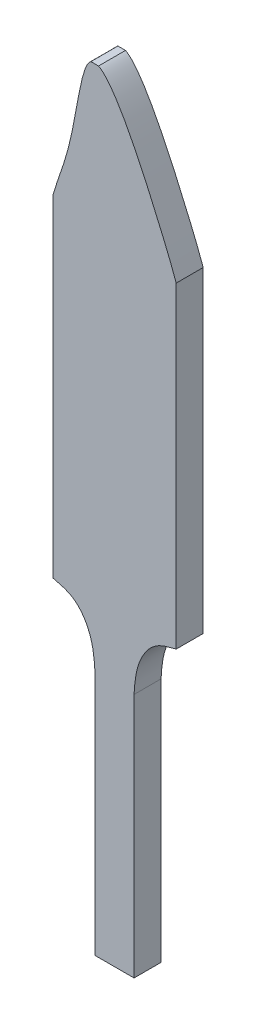
ISO-10303-21;
HEADER;
FILE_DESCRIPTION(('STEP AP214'),'2;1');
FILE_NAME('part.step','',(''),(''),'','','');
FILE_SCHEMA(('AUTOMOTIVE_DESIGN { 1 0 10303 214 1 1 1 1 }'));
ENDSEC;
DATA;
#1=APPLICATION_CONTEXT('core data for automotive mechanical design processes');
#2=APPLICATION_PROTOCOL_DEFINITION('international standard','automotive_design',2000,#1);
#3=PRODUCT_CONTEXT('',#1,'mechanical');
#4=PRODUCT('Part','Part','',(#3));
#5=PRODUCT_RELATED_PRODUCT_CATEGORY('part','',(#4));
#6=PRODUCT_DEFINITION_FORMATION('','',#4);
#7=PRODUCT_DEFINITION_CONTEXT('part definition',#1,'design');
#8=PRODUCT_DEFINITION('design','',#6,#7);
#9=PRODUCT_DEFINITION_SHAPE('','',#8);
#10=(LENGTH_UNIT() NAMED_UNIT(*) SI_UNIT(.MILLI.,.METRE.));
#11=(NAMED_UNIT(*) PLANE_ANGLE_UNIT() SI_UNIT($,.RADIAN.));
#12=(NAMED_UNIT(*) SI_UNIT($,.STERADIAN.) SOLID_ANGLE_UNIT());
#13=UNCERTAINTY_MEASURE_WITH_UNIT(LENGTH_MEASURE(1.E-05),#10,'distance_accuracy_value','');
#14=(GEOMETRIC_REPRESENTATION_CONTEXT(3) GLOBAL_UNCERTAINTY_ASSIGNED_CONTEXT((#13)) GLOBAL_UNIT_ASSIGNED_CONTEXT((#10,
#11,#12)) REPRESENTATION_CONTEXT('',''));
#15=CARTESIAN_POINT('',(0.,0.,0.));
#16=DIRECTION('',(0.,0.,1.));
#17=DIRECTION('',(1.,0.,0.));
#18=AXIS2_PLACEMENT_3D('',#15,#16,#17);
#19=CARTESIAN_POINT('',(-23.975,0.,-1.99999999999999));
#20=DIRECTION('',(-1.,0.,0.));
#21=DIRECTION('',(0.,-1.,0.));
#22=AXIS2_PLACEMENT_3D('',#19,#20,#21);
#23=PLANE('',#22);
#24=DIRECTION('',(0.,0.,1.));
#25=VECTOR('',#24,1.);
#26=CARTESIAN_POINT('',(-23.975,-31.1282309656145,-1.99999999999999));
#27=LINE('',#26,#25);
#28=CARTESIAN_POINT('',(-23.975,-31.1282309656145,-1.99999999999999));
#29=VERTEX_POINT('',#28);
#30=CARTESIAN_POINT('',(-23.975,-31.1282309656145,8.49));
#31=VERTEX_POINT('',#30);
#32=EDGE_CURVE('E50',#29,#31,#27,.T.);
#33=ORIENTED_EDGE('',*,*,#32,.T.);
#34=DIRECTION('',(0.,-1.,0.));
#35=VECTOR('',#34,1.);
#36=CARTESIAN_POINT('',(-23.975,0.,8.49));
#37=LINE('',#36,#35);
#38=CARTESIAN_POINT('',(-23.975,97.5505238768622,8.49));
#39=VERTEX_POINT('',#38);
#40=EDGE_CURVE('E125',#39,#31,#37,.T.);
#41=ORIENTED_EDGE('',*,*,#40,.F.);
#42=DIRECTION('',(0.,0.,1.));
#43=VECTOR('',#42,1.);
#44=CARTESIAN_POINT('',(-23.975,97.5505238768622,-1.99999999999999));
#45=LINE('',#44,#43);
#46=CARTESIAN_POINT('',(-23.975,97.5505238768622,-1.99999999999999));
#47=VERTEX_POINT('',#46);
#48=EDGE_CURVE('E11',#47,#39,#45,.T.);
#49=ORIENTED_EDGE('',*,*,#48,.F.);
#50=DIRECTION('',(0.,-1.,0.));
#51=VECTOR('',#50,1.);
#52=CARTESIAN_POINT('',(-23.975,0.,-1.99999999999999));
#53=LINE('',#52,#51);
#54=EDGE_CURVE('E127',#47,#29,#53,.T.);
#55=ORIENTED_EDGE('',*,*,#54,.T.);
#56=EDGE_LOOP('',(#33,#41,#49,#55));
#57=FACE_BOUND('',#56,.T.);
#58=ADVANCED_FACE('F47',(#57),#23,.T.);
#59=CARTESIAN_POINT('',(-23.975,97.5505238768622,-1.99999999999999));
#60=CARTESIAN_POINT('',(-22.5251406259906,102.797342224381,-1.99999999999999));
#61=CARTESIAN_POINT('',(-14.8305478493276,121.396895040696,-1.99999999999999));
#62=CARTESIAN_POINT('',(-11.9488582846209,171.207614923418,-1.99999999999999));
#63=CARTESIAN_POINT('',(10.8616595096742,124.472446819105,-1.99999999999999));
#64=CARTESIAN_POINT('',(22.1155040428258,97.2663613406689,-1.99999999999999));
#65=CARTESIAN_POINT('',(23.975,92.0389619979473,-1.99999999999999));
#66=B_SPLINE_CURVE_WITH_KNOTS('',3,(#59,#60,#61,#62,#63,#64,#65),.UNSPECIFIED.,.F.,.F.,(4,1,1,1,
4),(0.316420868998806,0.391637384851749,0.560410449616775,0.789536520766913,0.848897281299146),.UNSPECIFIED.);
#67=DIRECTION('',(0.,0.,1.));
#68=VECTOR('',#67,1.);
#69=SURFACE_OF_LINEAR_EXTRUSION('',#66,#68);
#70=ORIENTED_EDGE('',*,*,#48,.T.);
#71=CARTESIAN_POINT('',(-23.975,97.5505238768622,8.49));
#72=CARTESIAN_POINT('',(-22.5251406259906,102.797342224381,8.49));
#73=CARTESIAN_POINT('',(-14.8305478493276,121.396895040696,8.49));
#74=CARTESIAN_POINT('',(-11.9488582846209,171.207614923418,8.49));
#75=CARTESIAN_POINT('',(10.8616595096742,124.472446819105,8.49));
#76=CARTESIAN_POINT('',(22.1155040428258,97.2663613406689,8.49));
#77=CARTESIAN_POINT('',(23.975,92.0389619979473,8.49));
#78=B_SPLINE_CURVE_WITH_KNOTS('',3,(#71,#72,#73,#74,#75,#76,#77),.UNSPECIFIED.,.F.,.F.,(4,1,1,1,
4),(0.316420868998806,0.391637384851749,0.560410449616775,0.789536520766913,0.848897281299146),.UNSPECIFIED.);
#79=CARTESIAN_POINT('',(-9.18136073294807,150.000000000236,8.49));
#80=VERTEX_POINT('',#79);
#81=EDGE_CURVE('E145',#39,#80,#78,.T.);
#82=ORIENTED_EDGE('',*,*,#81,.T.);
#83=DIRECTION('',(0.,0.,1.));
#84=VECTOR('',#83,1.);
#85=CARTESIAN_POINT('',(-9.18136073294807,150.000000000236,-1.99999999999999));
#86=LINE('',#85,#84);
#87=CARTESIAN_POINT('',(-9.18136073294807,150.000000000236,-1.99999999999999));
#88=VERTEX_POINT('',#87);
#89=EDGE_CURVE('E56',#88,#80,#86,.T.);
#90=ORIENTED_EDGE('',*,*,#89,.F.);
#91=EDGE_CURVE('E69',#47,#88,#66,.T.);
#92=ORIENTED_EDGE('',*,*,#91,.F.);
#93=EDGE_LOOP('',(#70,#82,#90,#92));
#94=FACE_BOUND('',#93,.T.);
#95=ADVANCED_FACE('F249',(#94),#69,.F.);
#96=CARTESIAN_POINT('',(-5.61296205611121E-12,150.000000000236,-1.99999999999999));
#97=DIRECTION('',(0.,1.,0.));
#98=DIRECTION('',(-1.,0.,0.));
#99=AXIS2_PLACEMENT_3D('',#96,#97,#98);
#100=PLANE('',#99);
#101=ORIENTED_EDGE('',*,*,#89,.T.);
#102=DIRECTION('',(-1.,0.,0.));
#103=VECTOR('',#102,1.);
#104=CARTESIAN_POINT('',(-5.61296205611121E-12,150.000000000236,8.49));
#105=LINE('',#104,#103);
#106=CARTESIAN_POINT('',(-6.2144165058315,150.000000000236,8.49));
#107=VERTEX_POINT('',#106);
#108=EDGE_CURVE('E183',#107,#80,#105,.T.);
#109=ORIENTED_EDGE('',*,*,#108,.F.);
#110=DIRECTION('',(0.,0.,1.));
#111=VECTOR('',#110,1.);
#112=CARTESIAN_POINT('',(-6.2144165058315,150.000000000236,-1.99999999999999));
#113=LINE('',#112,#111);
#114=CARTESIAN_POINT('',(-6.2144165058315,150.000000000236,-1.99999999999999));
#115=VERTEX_POINT('',#114);
#116=EDGE_CURVE('E367',#115,#107,#113,.T.);
#117=ORIENTED_EDGE('',*,*,#116,.F.);
#118=DIRECTION('',(-1.,0.,0.));
#119=VECTOR('',#118,1.);
#120=CARTESIAN_POINT('',(-5.61296205611121E-12,150.000000000236,-1.99999999999999));
#121=LINE('',#120,#119);
#122=EDGE_CURVE('E244',#115,#88,#121,.T.);
#123=ORIENTED_EDGE('',*,*,#122,.T.);
#124=EDGE_LOOP('',(#101,#109,#117,#123));
#125=FACE_BOUND('',#124,.T.);
#126=ADVANCED_FACE('F252',(#125),#100,.T.);
#127=ORIENTED_EDGE('',*,*,#116,.T.);
#128=CARTESIAN_POINT('',(23.975,92.0389619979474,8.49));
#129=VERTEX_POINT('',#128);
#130=EDGE_CURVE('E177',#107,#129,#78,.T.);
#131=ORIENTED_EDGE('',*,*,#130,.T.);
#132=DIRECTION('',(0.,0.,1.));
#133=VECTOR('',#132,1.);
#134=CARTESIAN_POINT('',(23.975,92.0389619979474,-1.99999999999999));
#135=LINE('',#134,#133);
#136=CARTESIAN_POINT('',(23.975,92.0389619979474,-1.99999999999999));
#137=VERTEX_POINT('',#136);
#138=EDGE_CURVE('E364',#137,#129,#135,.T.);
#139=ORIENTED_EDGE('',*,*,#138,.F.);
#140=EDGE_CURVE('E238',#115,#137,#66,.T.);
#141=ORIENTED_EDGE('',*,*,#140,.F.);
#142=EDGE_LOOP('',(#127,#131,#139,#141));
#143=FACE_BOUND('',#142,.T.);
#144=ADVANCED_FACE('F254',(#143),#69,.F.);
#145=CARTESIAN_POINT('',(23.975,0.,-1.99999999999999));
#146=DIRECTION('',(-1.,0.,0.));
#147=DIRECTION('',(0.,0.,1.));
#148=AXIS2_PLACEMENT_3D('',#145,#146,#147);
#149=PLANE('',#148);
#150=ORIENTED_EDGE('',*,*,#138,.T.);
#151=DIRECTION('',(0.,-1.,0.));
#152=VECTOR('',#151,1.);
#153=CARTESIAN_POINT('',(23.975,0.,8.49));
#154=LINE('',#153,#152);
#155=CARTESIAN_POINT('',(23.975,-31.1282309656145,8.49));
#156=VERTEX_POINT('',#155);
#157=EDGE_CURVE('E170',#129,#156,#154,.T.);
#158=ORIENTED_EDGE('',*,*,#157,.T.);
#159=DIRECTION('',(0.,0.,1.));
#160=VECTOR('',#159,1.);
#161=CARTESIAN_POINT('',(23.975,-31.1282309656145,-1.99999999999999));
#162=LINE('',#161,#160);
#163=CARTESIAN_POINT('',(23.975,-31.1282309656145,-1.99999999999999));
#164=VERTEX_POINT('',#163);
#165=EDGE_CURVE('E361',#164,#156,#162,.T.);
#166=ORIENTED_EDGE('',*,*,#165,.F.);
#167=DIRECTION('',(0.,-1.,0.));
#168=VECTOR('',#167,1.);
#169=CARTESIAN_POINT('',(23.975,0.,-1.99999999999999));
#170=LINE('',#169,#168);
#171=EDGE_CURVE('E231',#137,#164,#170,.T.);
#172=ORIENTED_EDGE('',*,*,#171,.F.);
#173=EDGE_LOOP('',(#150,#158,#166,#172));
#174=FACE_BOUND('',#173,.T.);
#175=ADVANCED_FACE('F221',(#174),#149,.F.);
#176=CARTESIAN_POINT('',(23.975,-31.1282309656145,-1.99999999999999));
#177=CARTESIAN_POINT('',(21.2930570885535,-31.7806299142458,-1.99999999999999));
#178=CARTESIAN_POINT('',(13.9257230244143,-33.5727787989766,-1.99999999999999));
#179=CARTESIAN_POINT('',(8.29475383229255,-44.012214815306,-1.99999999999999));
#180=CARTESIAN_POINT('',(7.79178195174662,-51.6279141132162,-1.99999999999999));
#181=CARTESIAN_POINT('',(7.59591637822463,-54.5935934453036,-1.99999999999999));
#182=B_SPLINE_CURVE_WITH_KNOTS('',3,(#176,#177,#178,#179,#180,#181),.UNSPECIFIED.,.F.,.F.,(4,1,
1,4),(0.,0.258985483381417,0.711436684833984,1.),.UNSPECIFIED.);
#183=DIRECTION('',(0.,0.,1.));
#184=VECTOR('',#183,1.);
#185=SURFACE_OF_LINEAR_EXTRUSION('',#182,#184);
#186=ORIENTED_EDGE('',*,*,#165,.T.);
#187=CARTESIAN_POINT('',(23.975,-31.1282309656145,8.49));
#188=CARTESIAN_POINT('',(21.2930570885535,-31.7806299142458,8.49));
#189=CARTESIAN_POINT('',(13.9257230244143,-33.5727787989766,8.49));
#190=CARTESIAN_POINT('',(8.29475383229255,-44.012214815306,8.49));
#191=CARTESIAN_POINT('',(7.79178195174662,-51.6279141132162,8.49));
#192=CARTESIAN_POINT('',(7.59591637822463,-54.5935934453036,8.49));
#193=B_SPLINE_CURVE_WITH_KNOTS('',3,(#187,#188,#189,#190,#191,#192),.UNSPECIFIED.,.F.,.F.,(4,1,
1,4),(0.,0.258985483381417,0.711436684833984,1.),.UNSPECIFIED.);
#194=CARTESIAN_POINT('',(7.59591637822463,-54.5935934453036,8.49));
#195=VERTEX_POINT('',#194);
#196=EDGE_CURVE('E164',#156,#195,#193,.T.);
#197=ORIENTED_EDGE('',*,*,#196,.T.);
#198=DIRECTION('',(0.,0.,1.));
#199=VECTOR('',#198,1.);
#200=CARTESIAN_POINT('',(7.59591637822463,-54.5935934453036,-1.99999999999999));
#201=LINE('',#200,#199);
#202=CARTESIAN_POINT('',(7.59591637822463,-54.5935934453036,-1.99999999999999));
#203=VERTEX_POINT('',#202);
#204=EDGE_CURVE('E352',#203,#195,#201,.T.);
#205=ORIENTED_EDGE('',*,*,#204,.F.);
#206=EDGE_CURVE('E224',#164,#203,#182,.T.);
#207=ORIENTED_EDGE('',*,*,#206,.F.);
#208=EDGE_LOOP('',(#186,#197,#205,#207));
#209=FACE_BOUND('',#208,.T.);
#210=ADVANCED_FACE('F216',(#209),#185,.F.);
#211=CARTESIAN_POINT('',(7.59591637822462,0.,-1.99999999999999));
#212=DIRECTION('',(-1.,0.,0.));
#213=DIRECTION('',(0.,-1.,0.));
#214=AXIS2_PLACEMENT_3D('',#211,#212,#213);
#215=PLANE('',#214);
#216=ORIENTED_EDGE('',*,*,#204,.T.);
#217=DIRECTION('',(0.,-1.,0.));
#218=VECTOR('',#217,1.);
#219=CARTESIAN_POINT('',(7.59591637822462,0.,8.49));
#220=LINE('',#219,#218);
#221=CARTESIAN_POINT('',(7.59591637822464,-150.,8.49));
#222=VERTEX_POINT('',#221);
#223=EDGE_CURVE('E160',#195,#222,#220,.T.);
#224=ORIENTED_EDGE('',*,*,#223,.T.);
#225=DIRECTION('',(0.,0.,1.));
#226=VECTOR('',#225,1.);
#227=CARTESIAN_POINT('',(7.59591637822464,-150.,-1.99999999999999));
#228=LINE('',#227,#226);
#229=CARTESIAN_POINT('',(7.59591637822464,-150.,-1.99999999999999));
#230=VERTEX_POINT('',#229);
#231=EDGE_CURVE('E348',#230,#222,#228,.T.);
#232=ORIENTED_EDGE('',*,*,#231,.F.);
#233=DIRECTION('',(0.,-1.,0.));
#234=VECTOR('',#233,1.);
#235=CARTESIAN_POINT('',(7.59591637822462,0.,-1.99999999999999));
#236=LINE('',#235,#234);
#237=EDGE_CURVE('E232',#203,#230,#236,.T.);
#238=ORIENTED_EDGE('',*,*,#237,.F.);
#239=EDGE_LOOP('',(#216,#224,#232,#238));
#240=FACE_BOUND('',#239,.T.);
#241=ADVANCED_FACE('F212',(#240),#215,.F.);
#242=CARTESIAN_POINT('',(0.,-150.,-1.99999999999999));
#243=DIRECTION('',(0.,1.,0.));
#244=DIRECTION('',(0.,0.,1.));
#245=AXIS2_PLACEMENT_3D('',#242,#243,#244);
#246=PLANE('',#245);
#247=ORIENTED_EDGE('',*,*,#231,.T.);
#248=DIRECTION('',(-1.,0.,0.));
#249=VECTOR('',#248,1.);
#250=CARTESIAN_POINT('',(0.,-150.,8.49));
#251=LINE('',#250,#249);
#252=CARTESIAN_POINT('',(-7.59591637822464,-150.,8.49));
#253=VERTEX_POINT('',#252);
#254=EDGE_CURVE('E156',#222,#253,#251,.T.);
#255=ORIENTED_EDGE('',*,*,#254,.T.);
#256=DIRECTION('',(0.,0.,1.));
#257=VECTOR('',#256,1.);
#258=CARTESIAN_POINT('',(-7.59591637822464,-150.,-1.99999999999999));
#259=LINE('',#258,#257);
#260=CARTESIAN_POINT('',(-7.59591637822464,-150.,-1.99999999999999));
#261=VERTEX_POINT('',#260);
#262=EDGE_CURVE('E353',#261,#253,#259,.T.);
#263=ORIENTED_EDGE('',*,*,#262,.F.);
#264=DIRECTION('',(-1.,0.,0.));
#265=VECTOR('',#264,1.);
#266=CARTESIAN_POINT('',(0.,-150.,-1.99999999999999));
#267=LINE('',#266,#265);
#268=EDGE_CURVE('E339',#230,#261,#267,.T.);
#269=ORIENTED_EDGE('',*,*,#268,.F.);
#270=EDGE_LOOP('',(#247,#255,#263,#269));
#271=FACE_BOUND('',#270,.T.);
#272=ADVANCED_FACE('F208',(#271),#246,.F.);
#273=CARTESIAN_POINT('',(-7.59591637822461,0.,-1.99999999999999));
#274=DIRECTION('',(-1.,0.,0.));
#275=DIRECTION('',(0.,-1.,0.));
#276=AXIS2_PLACEMENT_3D('',#273,#274,#275);
#277=PLANE('',#276);
#278=ORIENTED_EDGE('',*,*,#262,.T.);
#279=DIRECTION('',(0.,-1.,0.));
#280=VECTOR('',#279,1.);
#281=CARTESIAN_POINT('',(-7.59591637822461,0.,8.49));
#282=LINE('',#281,#280);
#283=CARTESIAN_POINT('',(-7.59591637822462,-54.5935934453036,8.49));
#284=VERTEX_POINT('',#283);
#285=EDGE_CURVE('E140',#284,#253,#282,.T.);
#286=ORIENTED_EDGE('',*,*,#285,.F.);
#287=DIRECTION('',(0.,0.,1.));
#288=VECTOR('',#287,1.);
#289=CARTESIAN_POINT('',(-7.59591637822462,-54.5935934453036,-1.99999999999999));
#290=LINE('',#289,#288);
#291=CARTESIAN_POINT('',(-7.59591637822462,-54.5935934453036,-1.99999999999999));
#292=VERTEX_POINT('',#291);
#293=EDGE_CURVE('E132',#292,#284,#290,.T.);
#294=ORIENTED_EDGE('',*,*,#293,.F.);
#295=DIRECTION('',(0.,-1.,0.));
#296=VECTOR('',#295,1.);
#297=CARTESIAN_POINT('',(-7.59591637822461,0.,-1.99999999999999));
#298=LINE('',#297,#296);
#299=EDGE_CURVE('E197',#292,#261,#298,.T.);
#300=ORIENTED_EDGE('',*,*,#299,.T.);
#301=EDGE_LOOP('',(#278,#286,#294,#300));
#302=FACE_BOUND('',#301,.T.);
#303=ADVANCED_FACE('F205',(#302),#277,.T.);
#304=CARTESIAN_POINT('',(-23.975,-31.1282309656145,-1.99999999999999));
#305=CARTESIAN_POINT('',(-21.2930570885535,-31.7806299142458,-1.99999999999999));
#306=CARTESIAN_POINT('',(-13.9257230244143,-33.5727787989766,-1.99999999999999));
#307=CARTESIAN_POINT('',(-8.29475383229254,-44.012214815306,-1.99999999999999));
#308=CARTESIAN_POINT('',(-7.79178195174661,-51.6279141132162,-1.99999999999999));
#309=CARTESIAN_POINT('',(-7.59591637822462,-54.5935934453036,-1.99999999999999));
#310=B_SPLINE_CURVE_WITH_KNOTS('',3,(#304,#305,#306,#307,#308,#309),.UNSPECIFIED.,.F.,.F.,(4,1,
1,4),(0.,0.258985483381417,0.711436684833984,1.),.UNSPECIFIED.);
#311=DIRECTION('',(0.,0.,1.));
#312=VECTOR('',#311,1.);
#313=SURFACE_OF_LINEAR_EXTRUSION('',#310,#312);
#314=ORIENTED_EDGE('',*,*,#293,.T.);
#315=CARTESIAN_POINT('',(-23.975,-31.1282309656145,8.49));
#316=CARTESIAN_POINT('',(-21.2930570885535,-31.7806299142458,8.49));
#317=CARTESIAN_POINT('',(-13.9257230244143,-33.5727787989766,8.49));
#318=CARTESIAN_POINT('',(-8.29475383229254,-44.012214815306,8.49));
#319=CARTESIAN_POINT('',(-7.79178195174661,-51.6279141132162,8.49));
#320=CARTESIAN_POINT('',(-7.59591637822462,-54.5935934453036,8.49));
#321=B_SPLINE_CURVE_WITH_KNOTS('',3,(#315,#316,#317,#318,#319,#320),.UNSPECIFIED.,.F.,.F.,(4,1,
1,4),(0.,0.258985483381417,0.711436684833984,1.),.UNSPECIFIED.);
#322=EDGE_CURVE('E134',#31,#284,#321,.T.);
#323=ORIENTED_EDGE('',*,*,#322,.F.);
#324=ORIENTED_EDGE('',*,*,#32,.F.);
#325=EDGE_CURVE('E191',#29,#292,#310,.T.);
#326=ORIENTED_EDGE('',*,*,#325,.T.);
#327=EDGE_LOOP('',(#314,#323,#324,#326));
#328=FACE_BOUND('',#327,.T.);
#329=ADVANCED_FACE('F135',(#328),#313,.T.);
#330=CARTESIAN_POINT('',(0.,0.,-1.99999999999999));
#331=DIRECTION('',(0.,0.,1.));
#332=DIRECTION('',(1.,0.,0.));
#333=AXIS2_PLACEMENT_3D('',#330,#331,#332);
#334=PLANE('',#333);
#335=ORIENTED_EDGE('',*,*,#54,.F.);
#336=ORIENTED_EDGE('',*,*,#91,.T.);
#337=ORIENTED_EDGE('',*,*,#122,.F.);
#338=ORIENTED_EDGE('',*,*,#140,.T.);
#339=ORIENTED_EDGE('',*,*,#171,.T.);
#340=ORIENTED_EDGE('',*,*,#206,.T.);
#341=ORIENTED_EDGE('',*,*,#237,.T.);
#342=ORIENTED_EDGE('',*,*,#268,.T.);
#343=ORIENTED_EDGE('',*,*,#299,.F.);
#344=ORIENTED_EDGE('',*,*,#325,.F.);
#345=EDGE_LOOP('',(#335,#336,#337,#338,#339,#340,#341,#342,#343,#344));
#346=FACE_BOUND('',#345,.T.);
#347=ADVANCED_FACE('F204',(#346),#334,.F.);
#348=CARTESIAN_POINT('',(0.,0.,8.49));
#349=DIRECTION('',(0.,0.,1.));
#350=DIRECTION('',(1.,0.,0.));
#351=AXIS2_PLACEMENT_3D('',#348,#349,#350);
#352=PLANE('',#351);
#353=ORIENTED_EDGE('',*,*,#40,.T.);
#354=ORIENTED_EDGE('',*,*,#322,.T.);
#355=ORIENTED_EDGE('',*,*,#285,.T.);
#356=ORIENTED_EDGE('',*,*,#254,.F.);
#357=ORIENTED_EDGE('',*,*,#223,.F.);
#358=ORIENTED_EDGE('',*,*,#196,.F.);
#359=ORIENTED_EDGE('',*,*,#157,.F.);
#360=ORIENTED_EDGE('',*,*,#130,.F.);
#361=ORIENTED_EDGE('',*,*,#108,.T.);
#362=ORIENTED_EDGE('',*,*,#81,.F.);
#363=EDGE_LOOP('',(#353,#354,#355,#356,#357,#358,#359,#360,#361,#362));
#364=FACE_BOUND('',#363,.T.);
#365=ADVANCED_FACE('F142',(#364),#352,.T.);
#366=CLOSED_SHELL('',(#58,#95,#126,#144,#175,#210,#241,#272,#303,#329,#347,#365));
#367=MANIFOLD_SOLID_BREP('B2',#366);
#368=ADVANCED_BREP_SHAPE_REPRESENTATION('',(#18,#367),#14);
#369=SHAPE_DEFINITION_REPRESENTATION(#9,#368);
ENDSEC;
END-ISO-10303-21;
